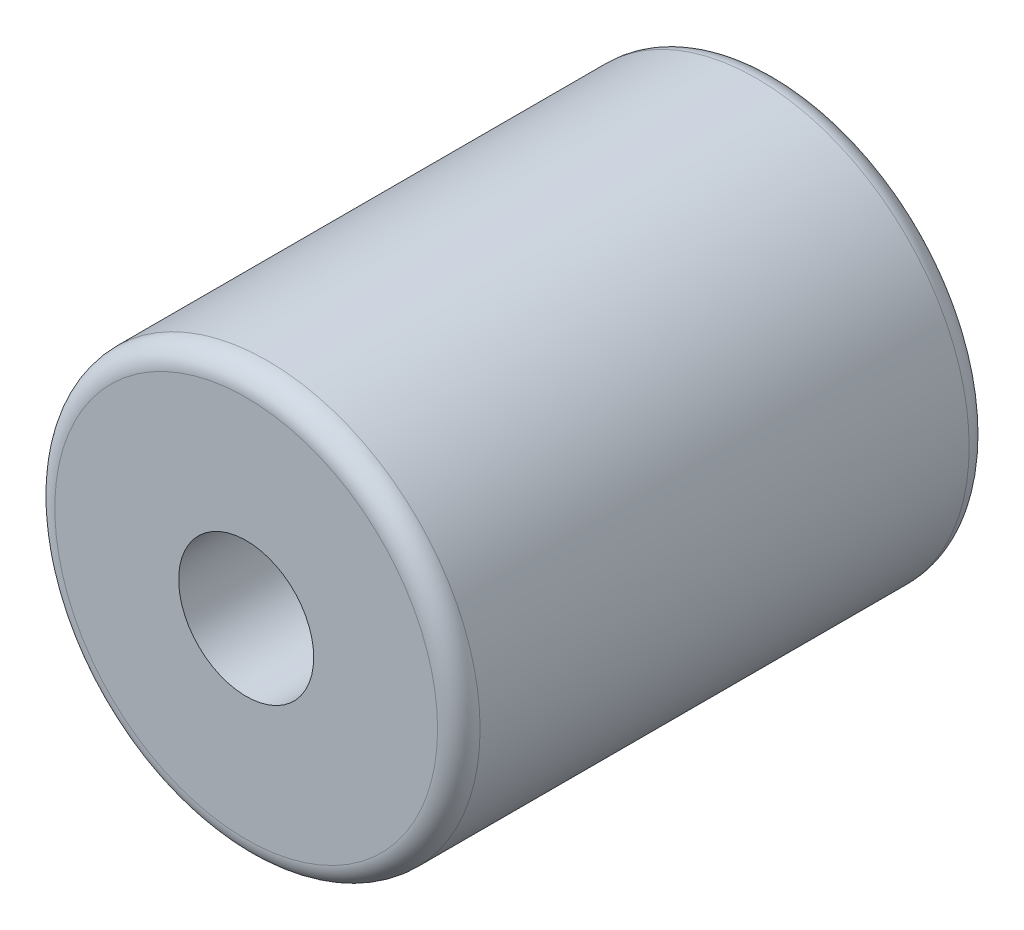
ISO-10303-21;
HEADER;
FILE_DESCRIPTION(('STEP AP214'),'2;1');
FILE_NAME('part.step','',(''),(''),'','','');
FILE_SCHEMA(('AUTOMOTIVE_DESIGN { 1 0 10303 214 1 1 1 1 }'));
ENDSEC;
DATA;
#1=APPLICATION_CONTEXT('core data for automotive mechanical design processes');
#2=APPLICATION_PROTOCOL_DEFINITION('international standard','automotive_design',2000,#1);
#3=PRODUCT_CONTEXT('',#1,'mechanical');
#4=PRODUCT('Part','Part','',(#3));
#5=PRODUCT_RELATED_PRODUCT_CATEGORY('part','',(#4));
#6=PRODUCT_DEFINITION_FORMATION('','',#4);
#7=PRODUCT_DEFINITION_CONTEXT('part definition',#1,'design');
#8=PRODUCT_DEFINITION('design','',#6,#7);
#9=PRODUCT_DEFINITION_SHAPE('','',#8);
#10=(LENGTH_UNIT() NAMED_UNIT(*) SI_UNIT(.MILLI.,.METRE.));
#11=(NAMED_UNIT(*) PLANE_ANGLE_UNIT() SI_UNIT($,.RADIAN.));
#12=(NAMED_UNIT(*) SI_UNIT($,.STERADIAN.) SOLID_ANGLE_UNIT());
#13=UNCERTAINTY_MEASURE_WITH_UNIT(LENGTH_MEASURE(1.E-05),#10,'distance_accuracy_value','');
#14=(GEOMETRIC_REPRESENTATION_CONTEXT(3) GLOBAL_UNCERTAINTY_ASSIGNED_CONTEXT((#13)) GLOBAL_UNIT_ASSIGNED_CONTEXT((#10,
#11,#12)) REPRESENTATION_CONTEXT('',''));
#15=CARTESIAN_POINT('',(0.,0.,0.));
#16=DIRECTION('',(0.,0.,1.));
#17=DIRECTION('',(1.,0.,0.));
#18=AXIS2_PLACEMENT_3D('',#15,#16,#17);
#19=CARTESIAN_POINT('',(0.,0.,25.));
#20=DIRECTION('',(0.,0.,1.));
#21=DIRECTION('',(1.,0.,0.));
#22=AXIS2_PLACEMENT_3D('',#19,#20,#21);
#23=PLANE('',#22);
#24=CARTESIAN_POINT('',(0.,0.,25.));
#25=DIRECTION('',(0.,0.,1.));
#26=DIRECTION('',(1.,0.,0.));
#27=AXIS2_PLACEMENT_3D('',#24,#25,#26);
#28=CIRCLE('',#27,9.);
#29=CARTESIAN_POINT('',(9.,0.,25.));
#30=VERTEX_POINT('',#29);
#31=EDGE_CURVE('E10',#30,#30,#28,.T.);
#32=ORIENTED_EDGE('',*,*,#31,.T.);
#33=EDGE_LOOP('',(#32));
#34=FACE_BOUND('',#33,.T.);
#35=CARTESIAN_POINT('',(0.,0.,25.));
#36=DIRECTION('',(0.,0.,1.));
#37=DIRECTION('',(1.,0.,0.));
#38=AXIS2_PLACEMENT_3D('',#35,#36,#37);
#39=CIRCLE('',#38,3.175);
#40=CARTESIAN_POINT('',(3.175,0.,25.));
#41=VERTEX_POINT('',#40);
#42=EDGE_CURVE('E51',#41,#41,#39,.T.);
#43=ORIENTED_EDGE('',*,*,#42,.F.);
#44=EDGE_LOOP('',(#43));
#45=FACE_BOUND('',#44,.T.);
#46=ADVANCED_FACE('F31',(#34,#45),#23,.T.);
#47=CARTESIAN_POINT('',(0.,0.,0.));
#48=DIRECTION('',(0.,0.,1.));
#49=DIRECTION('',(1.,0.,0.));
#50=AXIS2_PLACEMENT_3D('',#47,#48,#49);
#51=PLANE('',#50);
#52=CARTESIAN_POINT('',(0.,0.,0.));
#53=DIRECTION('',(0.,0.,1.));
#54=DIRECTION('',(1.,0.,0.));
#55=AXIS2_PLACEMENT_3D('',#52,#53,#54);
#56=CIRCLE('',#55,9.);
#57=CARTESIAN_POINT('',(9.,0.,0.));
#58=VERTEX_POINT('',#57);
#59=EDGE_CURVE('E38',#58,#58,#56,.F.);
#60=ORIENTED_EDGE('',*,*,#59,.T.);
#61=EDGE_LOOP('',(#60));
#62=FACE_BOUND('',#61,.T.);
#63=CARTESIAN_POINT('',(0.,0.,0.));
#64=DIRECTION('',(0.,0.,1.));
#65=DIRECTION('',(1.,0.,0.));
#66=AXIS2_PLACEMENT_3D('',#63,#64,#65);
#67=CIRCLE('',#66,3.175);
#68=CARTESIAN_POINT('',(3.175,0.,0.));
#69=VERTEX_POINT('',#68);
#70=EDGE_CURVE('E52',#69,#69,#67,.T.);
#71=ORIENTED_EDGE('',*,*,#70,.T.);
#72=EDGE_LOOP('',(#71));
#73=FACE_BOUND('',#72,.T.);
#74=ADVANCED_FACE('F62',(#62,#73),#51,.F.);
#75=CARTESIAN_POINT('',(0.,0.,25.));
#76=DIRECTION('',(0.,0.,-1.));
#77=DIRECTION('',(-1.,0.,0.));
#78=AXIS2_PLACEMENT_3D('',#75,#76,#77);
#79=CYLINDRICAL_SURFACE('',#78,10.);
#80=CARTESIAN_POINT('',(0.,0.,1.));
#81=DIRECTION('',(0.,0.,1.));
#82=DIRECTION('',(1.,0.,0.));
#83=AXIS2_PLACEMENT_3D('',#80,#81,#82);
#84=CIRCLE('',#83,10.);
#85=CARTESIAN_POINT('',(10.,0.,1.));
#86=VERTEX_POINT('',#85);
#87=EDGE_CURVE('E42',#86,#86,#84,.T.);
#88=ORIENTED_EDGE('',*,*,#87,.T.);
#89=EDGE_LOOP('',(#88));
#90=FACE_BOUND('',#89,.T.);
#91=CARTESIAN_POINT('',(0.,0.,24.));
#92=DIRECTION('',(0.,0.,1.));
#93=DIRECTION('',(1.,0.,0.));
#94=AXIS2_PLACEMENT_3D('',#91,#92,#93);
#95=CIRCLE('',#94,10.);
#96=CARTESIAN_POINT('',(10.,0.,24.));
#97=VERTEX_POINT('',#96);
#98=EDGE_CURVE('E46',#97,#97,#95,.F.);
#99=ORIENTED_EDGE('',*,*,#98,.T.);
#100=EDGE_LOOP('',(#99));
#101=FACE_BOUND('',#100,.T.);
#102=ADVANCED_FACE('F67',(#90,#101),#79,.T.);
#103=CARTESIAN_POINT('',(0.,0.,25.));
#104=DIRECTION('',(0.,0.,-1.));
#105=DIRECTION('',(-1.,0.,0.));
#106=AXIS2_PLACEMENT_3D('',#103,#104,#105);
#107=CYLINDRICAL_SURFACE('',#106,3.175);
#108=ORIENTED_EDGE('',*,*,#42,.T.);
#109=EDGE_LOOP('',(#108));
#110=FACE_BOUND('',#109,.T.);
#111=ORIENTED_EDGE('',*,*,#70,.F.);
#112=EDGE_LOOP('',(#111));
#113=FACE_BOUND('',#112,.T.);
#114=ADVANCED_FACE('F58',(#110,#113),#107,.F.);
#115=CARTESIAN_POINT('',(0.,0.,1.));
#116=DIRECTION('',(0.,0.,1.));
#117=DIRECTION('',(1.,0.,0.));
#118=AXIS2_PLACEMENT_3D('',#115,#116,#117);
#119=TOROIDAL_SURFACE('',#118,9.,1.);
#120=ORIENTED_EDGE('',*,*,#59,.F.);
#121=EDGE_LOOP('',(#120));
#122=FACE_BOUND('',#121,.T.);
#123=ORIENTED_EDGE('',*,*,#87,.F.);
#124=EDGE_LOOP('',(#123));
#125=FACE_BOUND('',#124,.T.);
#126=ADVANCED_FACE('F73',(#122,#125),#119,.T.);
#127=CARTESIAN_POINT('',(0.,0.,24.));
#128=DIRECTION('',(0.,0.,1.));
#129=DIRECTION('',(1.,0.,0.));
#130=AXIS2_PLACEMENT_3D('',#127,#128,#129);
#131=TOROIDAL_SURFACE('',#130,9.,1.);
#132=ORIENTED_EDGE('',*,*,#98,.F.);
#133=EDGE_LOOP('',(#132));
#134=FACE_BOUND('',#133,.T.);
#135=ORIENTED_EDGE('',*,*,#31,.F.);
#136=EDGE_LOOP('',(#135));
#137=FACE_BOUND('',#136,.T.);
#138=ADVANCED_FACE('F33',(#134,#137),#131,.T.);
#139=CLOSED_SHELL('',(#46,#74,#102,#114,#126,#138));
#140=MANIFOLD_SOLID_BREP('B2',#139);
#141=ADVANCED_BREP_SHAPE_REPRESENTATION('',(#18,#140),#14);
#142=SHAPE_DEFINITION_REPRESENTATION(#9,#141);
ENDSEC;
END-ISO-10303-21;
